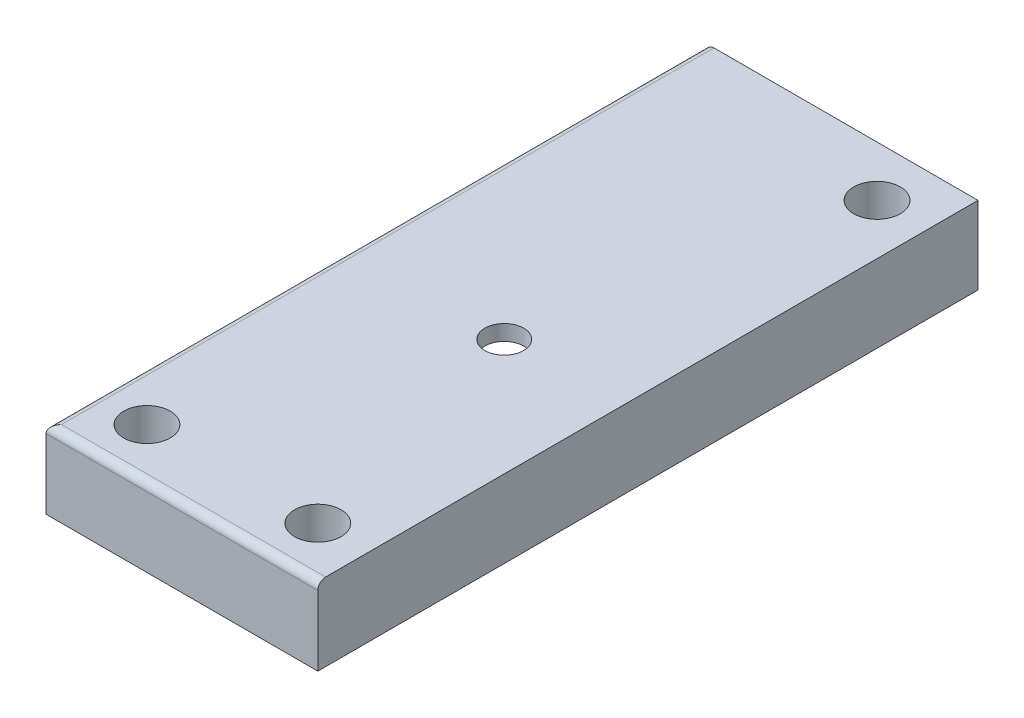
ISO-10303-21;
HEADER;
FILE_DESCRIPTION(('STEP AP214'),'2;1');
FILE_NAME('part.step','',(''),(''),'','','');
FILE_SCHEMA(('AUTOMOTIVE_DESIGN { 1 0 10303 214 1 1 1 1 }'));
ENDSEC;
DATA;
#1=APPLICATION_CONTEXT('core data for automotive mechanical design processes');
#2=APPLICATION_PROTOCOL_DEFINITION('international standard','automotive_design',2000,#1);
#3=PRODUCT_CONTEXT('',#1,'mechanical');
#4=PRODUCT('Part','Part','',(#3));
#5=PRODUCT_RELATED_PRODUCT_CATEGORY('part','',(#4));
#6=PRODUCT_DEFINITION_FORMATION('','',#4);
#7=PRODUCT_DEFINITION_CONTEXT('part definition',#1,'design');
#8=PRODUCT_DEFINITION('design','',#6,#7);
#9=PRODUCT_DEFINITION_SHAPE('','',#8);
#10=(LENGTH_UNIT() NAMED_UNIT(*) SI_UNIT(.MILLI.,.METRE.));
#11=(NAMED_UNIT(*) PLANE_ANGLE_UNIT() SI_UNIT($,.RADIAN.));
#12=(NAMED_UNIT(*) SI_UNIT($,.STERADIAN.) SOLID_ANGLE_UNIT());
#13=UNCERTAINTY_MEASURE_WITH_UNIT(LENGTH_MEASURE(1.E-05),#10,'distance_accuracy_value','');
#14=(GEOMETRIC_REPRESENTATION_CONTEXT(3) GLOBAL_UNCERTAINTY_ASSIGNED_CONTEXT((#13)) GLOBAL_UNIT_ASSIGNED_CONTEXT((#10,
#11,#12)) REPRESENTATION_CONTEXT('',''));
#15=CARTESIAN_POINT('',(0.,0.,0.));
#16=DIRECTION('',(0.,0.,1.));
#17=DIRECTION('',(1.,0.,0.));
#18=AXIS2_PLACEMENT_3D('',#15,#16,#17);
#19=CARTESIAN_POINT('',(11.,0.,-36.));
#20=DIRECTION('',(0.,1.,0.));
#21=DIRECTION('',(0.,0.,1.));
#22=AXIS2_PLACEMENT_3D('',#19,#20,#21);
#23=CYLINDRICAL_SURFACE('',#22,1.25);
#24=CARTESIAN_POINT('',(11.,0.,-36.));
#25=DIRECTION('',(0.,-1.,0.));
#26=DIRECTION('',(0.,0.,-1.));
#27=AXIS2_PLACEMENT_3D('',#24,#25,#26);
#28=CIRCLE('',#27,1.25);
#29=CARTESIAN_POINT('',(11.,0.,-37.25));
#30=VERTEX_POINT('',#29);
#31=EDGE_CURVE('E219',#30,#30,#28,.T.);
#32=ORIENTED_EDGE('',*,*,#31,.T.);
#33=EDGE_LOOP('',(#32));
#34=FACE_BOUND('',#33,.T.);
#35=CARTESIAN_POINT('',(11.,5.,-36.));
#36=DIRECTION('',(0.,1.,0.));
#37=DIRECTION('',(0.,0.,1.));
#38=AXIS2_PLACEMENT_3D('',#35,#36,#37);
#39=CIRCLE('',#38,1.25);
#40=CARTESIAN_POINT('',(11.,5.,-34.75));
#41=VERTEX_POINT('',#40);
#42=EDGE_CURVE('E226',#41,#41,#39,.T.);
#43=ORIENTED_EDGE('',*,*,#42,.T.);
#44=EDGE_LOOP('',(#43));
#45=FACE_BOUND('',#44,.T.);
#46=ADVANCED_FACE('F33',(#34,#45),#23,.F.);
#47=CARTESIAN_POINT('',(-11.,0.,36.));
#48=DIRECTION('',(0.,1.,0.));
#49=DIRECTION('',(0.,0.,1.));
#50=AXIS2_PLACEMENT_3D('',#47,#48,#49);
#51=CYLINDRICAL_SURFACE('',#50,1.25);
#52=CARTESIAN_POINT('',(-11.,0.,36.));
#53=DIRECTION('',(0.,-1.,0.));
#54=DIRECTION('',(0.,0.,-1.));
#55=AXIS2_PLACEMENT_3D('',#52,#53,#54);
#56=CIRCLE('',#55,1.25);
#57=CARTESIAN_POINT('',(-11.,0.,34.75));
#58=VERTEX_POINT('',#57);
#59=EDGE_CURVE('E292',#58,#58,#56,.T.);
#60=ORIENTED_EDGE('',*,*,#59,.T.);
#61=EDGE_LOOP('',(#60));
#62=FACE_BOUND('',#61,.T.);
#63=CARTESIAN_POINT('',(-11.,5.,36.));
#64=DIRECTION('',(0.,1.,0.));
#65=DIRECTION('',(0.,0.,1.));
#66=AXIS2_PLACEMENT_3D('',#63,#64,#65);
#67=CIRCLE('',#66,1.25);
#68=CARTESIAN_POINT('',(-11.,5.,37.25));
#69=VERTEX_POINT('',#68);
#70=EDGE_CURVE('E221',#69,#69,#67,.T.);
#71=ORIENTED_EDGE('',*,*,#70,.T.);
#72=EDGE_LOOP('',(#71));
#73=FACE_BOUND('',#72,.T.);
#74=ADVANCED_FACE('F362',(#62,#73),#51,.F.);
#75=CARTESIAN_POINT('',(11.,0.,36.));
#76=DIRECTION('',(0.,1.,0.));
#77=DIRECTION('',(0.,0.,1.));
#78=AXIS2_PLACEMENT_3D('',#75,#76,#77);
#79=CYLINDRICAL_SURFACE('',#78,1.25);
#80=CARTESIAN_POINT('',(11.,0.,36.));
#81=DIRECTION('',(0.,-1.,0.));
#82=DIRECTION('',(0.,0.,-1.));
#83=AXIS2_PLACEMENT_3D('',#80,#81,#82);
#84=CIRCLE('',#83,1.25);
#85=CARTESIAN_POINT('',(11.,0.,34.75));
#86=VERTEX_POINT('',#85);
#87=EDGE_CURVE('E164',#86,#86,#84,.T.);
#88=ORIENTED_EDGE('',*,*,#87,.T.);
#89=EDGE_LOOP('',(#88));
#90=FACE_BOUND('',#89,.T.);
#91=CARTESIAN_POINT('',(11.,5.,36.));
#92=DIRECTION('',(0.,1.,0.));
#93=DIRECTION('',(0.,0.,1.));
#94=AXIS2_PLACEMENT_3D('',#91,#92,#93);
#95=CIRCLE('',#94,1.25);
#96=CARTESIAN_POINT('',(11.,5.,37.25));
#97=VERTEX_POINT('',#96);
#98=EDGE_CURVE('E216',#97,#97,#95,.T.);
#99=ORIENTED_EDGE('',*,*,#98,.T.);
#100=EDGE_LOOP('',(#99));
#101=FACE_BOUND('',#100,.T.);
#102=ADVANCED_FACE('F368',(#90,#101),#79,.F.);
#103=CARTESIAN_POINT('',(15.5,8.,40.5));
#104=DIRECTION('',(1.,0.,0.));
#105=DIRECTION('',(0.,0.,-1.));
#106=AXIS2_PLACEMENT_3D('',#103,#104,#105);
#107=PLANE('',#106);
#108=DIRECTION('',(0.,1.,0.));
#109=VECTOR('',#108,1.);
#110=CARTESIAN_POINT('',(15.5,0.,-31.5));
#111=LINE('',#110,#109);
#112=CARTESIAN_POINT('',(15.5,0.,-31.5));
#113=VERTEX_POINT('',#112);
#114=CARTESIAN_POINT('',(15.5,8.,-31.5));
#115=VERTEX_POINT('',#114);
#116=EDGE_CURVE('E148',#113,#115,#111,.T.);
#117=ORIENTED_EDGE('',*,*,#116,.F.);
#118=DIRECTION('',(0.,0.,1.));
#119=VECTOR('',#118,1.);
#120=CARTESIAN_POINT('',(15.5,0.,40.5));
#121=LINE('',#120,#119);
#122=CARTESIAN_POINT('',(15.5,0.,31.5));
#123=VERTEX_POINT('',#122);
#124=EDGE_CURVE('E161',#113,#123,#121,.T.);
#125=ORIENTED_EDGE('',*,*,#124,.T.);
#126=DIRECTION('',(0.,1.,0.));
#127=VECTOR('',#126,1.);
#128=CARTESIAN_POINT('',(15.5,0.,31.5));
#129=LINE('',#128,#127);
#130=CARTESIAN_POINT('',(15.5,8.,31.5));
#131=VERTEX_POINT('',#130);
#132=EDGE_CURVE('E282',#123,#131,#129,.T.);
#133=ORIENTED_EDGE('',*,*,#132,.T.);
#134=DIRECTION('',(0.,0.,1.));
#135=VECTOR('',#134,1.);
#136=CARTESIAN_POINT('',(15.5,8.,40.5));
#137=LINE('',#136,#135);
#138=EDGE_CURVE('E163',#115,#131,#137,.T.);
#139=ORIENTED_EDGE('',*,*,#138,.F.);
#140=EDGE_LOOP('',(#117,#125,#133,#139));
#141=FACE_BOUND('',#140,.T.);
#142=ADVANCED_FACE('F159',(#141),#107,.F.);
#143=CARTESIAN_POINT('',(-15.5,8.,-40.5));
#144=DIRECTION('',(0.,0.,-1.));
#145=DIRECTION('',(-1.,0.,0.));
#146=AXIS2_PLACEMENT_3D('',#143,#144,#145);
#147=PLANE('',#146);
#148=DIRECTION('',(0.,1.,0.));
#149=VECTOR('',#148,1.);
#150=CARTESIAN_POINT('',(6.50000000000001,0.,-40.5));
#151=LINE('',#150,#149);
#152=CARTESIAN_POINT('',(6.50000000000001,0.,-40.5));
#153=VERTEX_POINT('',#152);
#154=CARTESIAN_POINT('',(6.50000000000001,8.,-40.5));
#155=VERTEX_POINT('',#154);
#156=EDGE_CURVE('E269',#153,#155,#151,.T.);
#157=ORIENTED_EDGE('',*,*,#156,.T.);
#158=DIRECTION('',(1.,0.,0.));
#159=VECTOR('',#158,1.);
#160=CARTESIAN_POINT('',(-15.5,8.,-40.5));
#161=LINE('',#160,#159);
#162=CARTESIAN_POINT('',(-15.5,8.,-40.5));
#163=VERTEX_POINT('',#162);
#164=EDGE_CURVE('E179',#163,#155,#161,.T.);
#165=ORIENTED_EDGE('',*,*,#164,.F.);
#166=DIRECTION('',(0.,-1.,0.));
#167=VECTOR('',#166,1.);
#168=CARTESIAN_POINT('',(-15.5,8.,-40.5));
#169=LINE('',#168,#167);
#170=CARTESIAN_POINT('',(-15.5,0.,-40.5));
#171=VERTEX_POINT('',#170);
#172=EDGE_CURVE('E186',#163,#171,#169,.T.);
#173=ORIENTED_EDGE('',*,*,#172,.T.);
#174=DIRECTION('',(1.,0.,0.));
#175=VECTOR('',#174,1.);
#176=CARTESIAN_POINT('',(-15.5,0.,-40.5));
#177=LINE('',#176,#175);
#178=EDGE_CURVE('E183',#171,#153,#177,.T.);
#179=ORIENTED_EDGE('',*,*,#178,.T.);
#180=EDGE_LOOP('',(#157,#165,#173,#179));
#181=FACE_BOUND('',#180,.T.);
#182=ADVANCED_FACE('F322',(#181),#147,.F.);
#183=CARTESIAN_POINT('',(-15.5,8.,40.5));
#184=DIRECTION('',(0.,0.,1.));
#185=DIRECTION('',(1.,0.,0.));
#186=AXIS2_PLACEMENT_3D('',#183,#184,#185);
#187=PLANE('',#186);
#188=DIRECTION('',(0.,1.,0.));
#189=VECTOR('',#188,1.);
#190=CARTESIAN_POINT('',(6.5,0.,40.5));
#191=LINE('',#190,#189);
#192=CARTESIAN_POINT('',(6.5,0.,40.5));
#193=VERTEX_POINT('',#192);
#194=CARTESIAN_POINT('',(6.5,8.,40.5));
#195=VERTEX_POINT('',#194);
#196=EDGE_CURVE('E290',#193,#195,#191,.T.);
#197=ORIENTED_EDGE('',*,*,#196,.F.);
#198=DIRECTION('',(-1.,0.,0.));
#199=VECTOR('',#198,1.);
#200=CARTESIAN_POINT('',(-15.5,0.,40.5));
#201=LINE('',#200,#199);
#202=CARTESIAN_POINT('',(-6.5,0.,40.5));
#203=VERTEX_POINT('',#202);
#204=EDGE_CURVE('E171',#193,#203,#201,.T.);
#205=ORIENTED_EDGE('',*,*,#204,.T.);
#206=DIRECTION('',(0.,1.,0.));
#207=VECTOR('',#206,1.);
#208=CARTESIAN_POINT('',(-6.5,0.,40.5));
#209=LINE('',#208,#207);
#210=CARTESIAN_POINT('',(-6.5,8.,40.5));
#211=VERTEX_POINT('',#210);
#212=EDGE_CURVE('E302',#203,#211,#209,.T.);
#213=ORIENTED_EDGE('',*,*,#212,.T.);
#214=DIRECTION('',(-1.,0.,0.));
#215=VECTOR('',#214,1.);
#216=CARTESIAN_POINT('',(-15.5,8.,40.5));
#217=LINE('',#216,#215);
#218=EDGE_CURVE('E311',#195,#211,#217,.T.);
#219=ORIENTED_EDGE('',*,*,#218,.F.);
#220=EDGE_LOOP('',(#197,#205,#213,#219));
#221=FACE_BOUND('',#220,.T.);
#222=ADVANCED_FACE('F338',(#221),#187,.F.);
#223=CARTESIAN_POINT('',(-15.5,8.,40.5));
#224=DIRECTION('',(-1.,0.,0.));
#225=DIRECTION('',(0.,0.,1.));
#226=AXIS2_PLACEMENT_3D('',#223,#224,#225);
#227=PLANE('',#226);
#228=DIRECTION('',(0.,1.,0.));
#229=VECTOR('',#228,1.);
#230=CARTESIAN_POINT('',(-15.5,0.,31.5));
#231=LINE('',#230,#229);
#232=CARTESIAN_POINT('',(-15.5,0.,31.5));
#233=VERTEX_POINT('',#232);
#234=CARTESIAN_POINT('',(-15.5,8.,31.5));
#235=VERTEX_POINT('',#234);
#236=EDGE_CURVE('E172',#233,#235,#231,.T.);
#237=ORIENTED_EDGE('',*,*,#236,.F.);
#238=DIRECTION('',(0.,0.,-1.));
#239=VECTOR('',#238,1.);
#240=CARTESIAN_POINT('',(-15.5,0.,40.5));
#241=LINE('',#240,#239);
#242=EDGE_CURVE('E174',#233,#171,#241,.T.);
#243=ORIENTED_EDGE('',*,*,#242,.T.);
#244=ORIENTED_EDGE('',*,*,#172,.F.);
#245=DIRECTION('',(0.,0.,-1.));
#246=VECTOR('',#245,1.);
#247=CARTESIAN_POINT('',(-15.5,8.,40.5));
#248=LINE('',#247,#246);
#249=EDGE_CURVE('E312',#235,#163,#248,.T.);
#250=ORIENTED_EDGE('',*,*,#249,.F.);
#251=EDGE_LOOP('',(#237,#243,#244,#250));
#252=FACE_BOUND('',#251,.T.);
#253=ADVANCED_FACE('F348',(#252),#227,.F.);
#254=CARTESIAN_POINT('',(17.5,10.,-42.5));
#255=DIRECTION('',(-1.,0.,0.));
#256=DIRECTION('',(0.,0.,1.));
#257=AXIS2_PLACEMENT_3D('',#254,#255,#256);
#258=PLANE('',#257);
#259=DIRECTION('',(0.,0.,-1.));
#260=VECTOR('',#259,1.);
#261=CARTESIAN_POINT('',(17.5,10.,-42.5));
#262=LINE('',#261,#260);
#263=CARTESIAN_POINT('',(17.5,10.,41.5));
#264=VERTEX_POINT('',#263);
#265=CARTESIAN_POINT('',(17.5,10.,-42.5));
#266=VERTEX_POINT('',#265);
#267=EDGE_CURVE('E190',#264,#266,#262,.T.);
#268=ORIENTED_EDGE('',*,*,#267,.F.);
#269=CARTESIAN_POINT('',(17.5,9.,41.5));
#270=DIRECTION('',(-1.,0.,0.));
#271=DIRECTION('',(0.,0.,1.));
#272=AXIS2_PLACEMENT_3D('',#269,#270,#271);
#273=CIRCLE('',#272,1.);
#274=CARTESIAN_POINT('',(17.5,9.,42.5));
#275=VERTEX_POINT('',#274);
#276=EDGE_CURVE('E42',#264,#275,#273,.F.);
#277=ORIENTED_EDGE('',*,*,#276,.T.);
#278=DIRECTION('',(0.,-1.,0.));
#279=VECTOR('',#278,1.);
#280=CARTESIAN_POINT('',(17.5,10.,42.5));
#281=LINE('',#280,#279);
#282=CARTESIAN_POINT('',(17.5,0.,42.5));
#283=VERTEX_POINT('',#282);
#284=EDGE_CURVE('E196',#275,#283,#281,.T.);
#285=ORIENTED_EDGE('',*,*,#284,.T.);
#286=DIRECTION('',(0.,0.,-1.));
#287=VECTOR('',#286,1.);
#288=CARTESIAN_POINT('',(17.5,0.,-42.5));
#289=LINE('',#288,#287);
#290=CARTESIAN_POINT('',(17.5,0.,-42.5));
#291=VERTEX_POINT('',#290);
#292=EDGE_CURVE('E189',#283,#291,#289,.T.);
#293=ORIENTED_EDGE('',*,*,#292,.T.);
#294=DIRECTION('',(0.,-1.,0.));
#295=VECTOR('',#294,1.);
#296=CARTESIAN_POINT('',(17.5,10.,-42.5));
#297=LINE('',#296,#295);
#298=EDGE_CURVE('E212',#266,#291,#297,.T.);
#299=ORIENTED_EDGE('',*,*,#298,.F.);
#300=EDGE_LOOP('',(#268,#277,#285,#293,#299));
#301=FACE_BOUND('',#300,.T.);
#302=ADVANCED_FACE('F581',(#301),#258,.F.);
#303=CARTESIAN_POINT('',(-17.5,10.,-42.5));
#304=DIRECTION('',(0.,0.,1.));
#305=DIRECTION('',(1.,0.,0.));
#306=AXIS2_PLACEMENT_3D('',#303,#304,#305);
#307=PLANE('',#306);
#308=DIRECTION('',(0.,-1.,0.));
#309=VECTOR('',#308,1.);
#310=CARTESIAN_POINT('',(-17.5,10.,-42.5));
#311=LINE('',#310,#309);
#312=CARTESIAN_POINT('',(-17.5,9.,-42.5));
#313=VERTEX_POINT('',#312);
#314=CARTESIAN_POINT('',(-17.5,0.,-42.5));
#315=VERTEX_POINT('',#314);
#316=EDGE_CURVE('E210',#313,#315,#311,.T.);
#317=ORIENTED_EDGE('',*,*,#316,.F.);
#318=CARTESIAN_POINT('',(-16.5,9.,-42.5));
#319=DIRECTION('',(0.,0.,1.));
#320=DIRECTION('',(1.,0.,0.));
#321=AXIS2_PLACEMENT_3D('',#318,#319,#320);
#322=CIRCLE('',#321,1.);
#323=CARTESIAN_POINT('',(-16.5,10.,-42.5));
#324=VERTEX_POINT('',#323);
#325=EDGE_CURVE('E236',#313,#324,#322,.F.);
#326=ORIENTED_EDGE('',*,*,#325,.T.);
#327=DIRECTION('',(-1.,0.,0.));
#328=VECTOR('',#327,1.);
#329=CARTESIAN_POINT('',(-17.5,10.,-42.5));
#330=LINE('',#329,#328);
#331=EDGE_CURVE('E192',#266,#324,#330,.T.);
#332=ORIENTED_EDGE('',*,*,#331,.F.);
#333=ORIENTED_EDGE('',*,*,#298,.T.);
#334=DIRECTION('',(-1.,0.,0.));
#335=VECTOR('',#334,1.);
#336=CARTESIAN_POINT('',(-17.5,0.,-42.5));
#337=LINE('',#336,#335);
#338=EDGE_CURVE('E199',#291,#315,#337,.T.);
#339=ORIENTED_EDGE('',*,*,#338,.T.);
#340=EDGE_LOOP('',(#317,#326,#332,#333,#339));
#341=FACE_BOUND('',#340,.T.);
#342=ADVANCED_FACE('F585',(#341),#307,.F.);
#343=CARTESIAN_POINT('',(-17.5,10.,-42.5));
#344=DIRECTION('',(1.,0.,0.));
#345=DIRECTION('',(0.,0.,-1.));
#346=AXIS2_PLACEMENT_3D('',#343,#344,#345);
#347=PLANE('',#346);
#348=DIRECTION('',(0.,-1.,0.));
#349=VECTOR('',#348,1.);
#350=CARTESIAN_POINT('',(-17.5,10.,42.5));
#351=LINE('',#350,#349);
#352=CARTESIAN_POINT('',(-17.5,9.,42.5));
#353=VERTEX_POINT('',#352);
#354=CARTESIAN_POINT('',(-17.5,0.,42.5));
#355=VERTEX_POINT('',#354);
#356=EDGE_CURVE('E208',#353,#355,#351,.T.);
#357=ORIENTED_EDGE('',*,*,#356,.F.);
#358=DIRECTION('',(0.,0.,1.));
#359=VECTOR('',#358,1.);
#360=CARTESIAN_POINT('',(-17.5,9.,-42.5));
#361=LINE('',#360,#359);
#362=EDGE_CURVE('E57',#353,#313,#361,.F.);
#363=ORIENTED_EDGE('',*,*,#362,.T.);
#364=ORIENTED_EDGE('',*,*,#316,.T.);
#365=DIRECTION('',(0.,0.,1.));
#366=VECTOR('',#365,1.);
#367=CARTESIAN_POINT('',(-17.5,0.,-42.5));
#368=LINE('',#367,#366);
#369=EDGE_CURVE('E202',#315,#355,#368,.T.);
#370=ORIENTED_EDGE('',*,*,#369,.T.);
#371=EDGE_LOOP('',(#357,#363,#364,#370));
#372=FACE_BOUND('',#371,.T.);
#373=ADVANCED_FACE('F591',(#372),#347,.F.);
#374=CARTESIAN_POINT('',(-17.5,10.,42.5));
#375=DIRECTION('',(0.,0.,-1.));
#376=DIRECTION('',(-1.,0.,0.));
#377=AXIS2_PLACEMENT_3D('',#374,#375,#376);
#378=PLANE('',#377);
#379=ORIENTED_EDGE('',*,*,#284,.F.);
#380=DIRECTION('',(1.,0.,0.));
#381=VECTOR('',#380,1.);
#382=CARTESIAN_POINT('',(-17.5,9.,42.5));
#383=LINE('',#382,#381);
#384=EDGE_CURVE('E11',#275,#353,#383,.F.);
#385=ORIENTED_EDGE('',*,*,#384,.T.);
#386=ORIENTED_EDGE('',*,*,#356,.T.);
#387=DIRECTION('',(1.,0.,0.));
#388=VECTOR('',#387,1.);
#389=CARTESIAN_POINT('',(-17.5,0.,42.5));
#390=LINE('',#389,#388);
#391=EDGE_CURVE('E193',#355,#283,#390,.T.);
#392=ORIENTED_EDGE('',*,*,#391,.T.);
#393=EDGE_LOOP('',(#379,#385,#386,#392));
#394=FACE_BOUND('',#393,.T.);
#395=ADVANCED_FACE('F481',(#394),#378,.F.);
#396=CARTESIAN_POINT('',(0.,10.,0.));
#397=DIRECTION('',(0.,1.,0.));
#398=DIRECTION('',(0.,0.,1.));
#399=AXIS2_PLACEMENT_3D('',#396,#397,#398);
#400=PLANE('',#399);
#401=CARTESIAN_POINT('',(2.5,10.,3.50000000000002));
#402=DIRECTION('',(0.,1.,0.));
#403=DIRECTION('',(0.,0.,1.));
#404=AXIS2_PLACEMENT_3D('',#401,#402,#403);
#405=CIRCLE('',#404,2.5);
#406=CARTESIAN_POINT('',(2.5,10.,6.00000000000002));
#407=VERTEX_POINT('',#406);
#408=EDGE_CURVE('E247',#407,#407,#405,.T.);
#409=ORIENTED_EDGE('',*,*,#408,.F.);
#410=EDGE_LOOP('',(#409));
#411=FACE_BOUND('',#410,.T.);
#412=CARTESIAN_POINT('',(11.,10.,-36.));
#413=DIRECTION('',(0.,1.,0.));
#414=DIRECTION('',(0.,0.,1.));
#415=AXIS2_PLACEMENT_3D('',#412,#413,#414);
#416=CIRCLE('',#415,3.);
#417=CARTESIAN_POINT('',(11.,10.,-33.));
#418=VERTEX_POINT('',#417);
#419=EDGE_CURVE('E239',#418,#418,#416,.T.);
#420=ORIENTED_EDGE('',*,*,#419,.F.);
#421=EDGE_LOOP('',(#420));
#422=FACE_BOUND('',#421,.T.);
#423=CARTESIAN_POINT('',(-11.,10.,36.));
#424=DIRECTION('',(0.,1.,0.));
#425=DIRECTION('',(0.,0.,1.));
#426=AXIS2_PLACEMENT_3D('',#423,#424,#425);
#427=CIRCLE('',#426,3.);
#428=CARTESIAN_POINT('',(-11.,10.,39.));
#429=VERTEX_POINT('',#428);
#430=EDGE_CURVE('E229',#429,#429,#427,.T.);
#431=ORIENTED_EDGE('',*,*,#430,.F.);
#432=EDGE_LOOP('',(#431));
#433=FACE_BOUND('',#432,.T.);
#434=CARTESIAN_POINT('',(11.,10.,36.));
#435=DIRECTION('',(0.,1.,0.));
#436=DIRECTION('',(0.,0.,1.));
#437=AXIS2_PLACEMENT_3D('',#434,#435,#436);
#438=CIRCLE('',#437,3.);
#439=CARTESIAN_POINT('',(11.,10.,39.));
#440=VERTEX_POINT('',#439);
#441=EDGE_CURVE('E224',#440,#440,#438,.T.);
#442=ORIENTED_EDGE('',*,*,#441,.F.);
#443=EDGE_LOOP('',(#442));
#444=FACE_BOUND('',#443,.T.);
#445=ORIENTED_EDGE('',*,*,#331,.T.);
#446=DIRECTION('',(0.,0.,1.));
#447=VECTOR('',#446,1.);
#448=CARTESIAN_POINT('',(-16.5,10.,42.5));
#449=LINE('',#448,#447);
#450=CARTESIAN_POINT('',(-16.5,10.,41.5));
#451=VERTEX_POINT('',#450);
#452=EDGE_CURVE('E232',#324,#451,#449,.T.);
#453=ORIENTED_EDGE('',*,*,#452,.T.);
#454=DIRECTION('',(1.,0.,0.));
#455=VECTOR('',#454,1.);
#456=CARTESIAN_POINT('',(17.5,10.,41.5));
#457=LINE('',#456,#455);
#458=EDGE_CURVE('E215',#451,#264,#457,.T.);
#459=ORIENTED_EDGE('',*,*,#458,.T.);
#460=ORIENTED_EDGE('',*,*,#267,.T.);
#461=EDGE_LOOP('',(#445,#453,#459,#460));
#462=FACE_BOUND('',#461,.T.);
#463=ADVANCED_FACE('F478',(#411,#422,#433,#444,#462),#400,.T.);
#464=CARTESIAN_POINT('',(0.,0.,0.));
#465=DIRECTION('',(0.,1.,0.));
#466=DIRECTION('',(0.,0.,1.));
#467=AXIS2_PLACEMENT_3D('',#464,#465,#466);
#468=PLANE('',#467);
#469=ORIENTED_EDGE('',*,*,#124,.F.);
#470=DIRECTION('',(-1.,0.,0.));
#471=VECTOR('',#470,1.);
#472=CARTESIAN_POINT('',(15.5,0.,-31.5));
#473=LINE('',#472,#471);
#474=CARTESIAN_POINT('',(6.50000000000001,0.,-31.5));
#475=VERTEX_POINT('',#474);
#476=EDGE_CURVE('E144',#113,#475,#473,.T.);
#477=ORIENTED_EDGE('',*,*,#476,.T.);
#478=DIRECTION('',(0.,0.,-1.));
#479=VECTOR('',#478,1.);
#480=CARTESIAN_POINT('',(6.50000000000001,0.,-40.5));
#481=LINE('',#480,#479);
#482=EDGE_CURVE('E154',#475,#153,#481,.T.);
#483=ORIENTED_EDGE('',*,*,#482,.T.);
#484=ORIENTED_EDGE('',*,*,#178,.F.);
#485=ORIENTED_EDGE('',*,*,#242,.F.);
#486=DIRECTION('',(1.,0.,0.));
#487=VECTOR('',#486,1.);
#488=CARTESIAN_POINT('',(-15.5,0.,31.5));
#489=LINE('',#488,#487);
#490=CARTESIAN_POINT('',(-6.5,0.,31.5));
#491=VERTEX_POINT('',#490);
#492=EDGE_CURVE('E296',#233,#491,#489,.T.);
#493=ORIENTED_EDGE('',*,*,#492,.T.);
#494=DIRECTION('',(0.,0.,1.));
#495=VECTOR('',#494,1.);
#496=CARTESIAN_POINT('',(-6.5,0.,40.5));
#497=LINE('',#496,#495);
#498=EDGE_CURVE('E298',#491,#203,#497,.T.);
#499=ORIENTED_EDGE('',*,*,#498,.T.);
#500=ORIENTED_EDGE('',*,*,#204,.F.);
#501=DIRECTION('',(0.,0.,-1.));
#502=VECTOR('',#501,1.);
#503=CARTESIAN_POINT('',(6.5,0.,40.5));
#504=LINE('',#503,#502);
#505=CARTESIAN_POINT('',(6.5,0.,31.5));
#506=VERTEX_POINT('',#505);
#507=EDGE_CURVE('E278',#193,#506,#504,.T.);
#508=ORIENTED_EDGE('',*,*,#507,.T.);
#509=DIRECTION('',(1.,0.,0.));
#510=VECTOR('',#509,1.);
#511=CARTESIAN_POINT('',(15.5,0.,31.5));
#512=LINE('',#511,#510);
#513=EDGE_CURVE('E169',#506,#123,#512,.T.);
#514=ORIENTED_EDGE('',*,*,#513,.T.);
#515=EDGE_LOOP('',(#469,#477,#483,#484,#485,#493,#499,#500,#508,#514));
#516=FACE_BOUND('',#515,.T.);
#517=ORIENTED_EDGE('',*,*,#292,.F.);
#518=ORIENTED_EDGE('',*,*,#391,.F.);
#519=ORIENTED_EDGE('',*,*,#369,.F.);
#520=ORIENTED_EDGE('',*,*,#338,.F.);
#521=EDGE_LOOP('',(#517,#518,#519,#520));
#522=FACE_BOUND('',#521,.T.);
#523=ORIENTED_EDGE('',*,*,#59,.F.);
#524=EDGE_LOOP('',(#523));
#525=FACE_BOUND('',#524,.T.);
#526=ORIENTED_EDGE('',*,*,#87,.F.);
#527=EDGE_LOOP('',(#526));
#528=FACE_BOUND('',#527,.T.);
#529=ORIENTED_EDGE('',*,*,#31,.F.);
#530=EDGE_LOOP('',(#529));
#531=FACE_BOUND('',#530,.T.);
#532=ADVANCED_FACE('F166',(#516,#522,#525,#528,#531),#468,.F.);
#533=CARTESIAN_POINT('',(0.,8.,0.));
#534=DIRECTION('',(0.,-1.,0.));
#535=DIRECTION('',(0.,0.,-1.));
#536=AXIS2_PLACEMENT_3D('',#533,#534,#535);
#537=PLANE('',#536);
#538=CARTESIAN_POINT('',(2.5,8.,3.50000000000002));
#539=DIRECTION('',(0.,-1.,0.));
#540=DIRECTION('',(0.,0.,-1.));
#541=AXIS2_PLACEMENT_3D('',#538,#539,#540);
#542=CIRCLE('',#541,2.5);
#543=CARTESIAN_POINT('',(2.5,8.,1.00000000000002));
#544=VERTEX_POINT('',#543);
#545=EDGE_CURVE('E37',#544,#544,#542,.T.);
#546=ORIENTED_EDGE('',*,*,#545,.F.);
#547=EDGE_LOOP('',(#546));
#548=FACE_BOUND('',#547,.T.);
#549=DIRECTION('',(0.,0.,-1.));
#550=VECTOR('',#549,1.);
#551=CARTESIAN_POINT('',(6.50000000000001,8.,-40.5));
#552=LINE('',#551,#550);
#553=CARTESIAN_POINT('',(6.50000000000001,8.,-31.5));
#554=VERTEX_POINT('',#553);
#555=EDGE_CURVE('E155',#554,#155,#552,.T.);
#556=ORIENTED_EDGE('',*,*,#555,.F.);
#557=DIRECTION('',(-1.,0.,0.));
#558=VECTOR('',#557,1.);
#559=CARTESIAN_POINT('',(15.5,8.,-31.5));
#560=LINE('',#559,#558);
#561=EDGE_CURVE('E266',#115,#554,#560,.T.);
#562=ORIENTED_EDGE('',*,*,#561,.F.);
#563=ORIENTED_EDGE('',*,*,#138,.T.);
#564=DIRECTION('',(1.,0.,0.));
#565=VECTOR('',#564,1.);
#566=CARTESIAN_POINT('',(15.5,8.,31.5));
#567=LINE('',#566,#565);
#568=CARTESIAN_POINT('',(6.5,8.,31.5));
#569=VERTEX_POINT('',#568);
#570=EDGE_CURVE('E280',#569,#131,#567,.T.);
#571=ORIENTED_EDGE('',*,*,#570,.F.);
#572=DIRECTION('',(0.,0.,-1.));
#573=VECTOR('',#572,1.);
#574=CARTESIAN_POINT('',(6.5,8.,40.5));
#575=LINE('',#574,#573);
#576=EDGE_CURVE('E277',#195,#569,#575,.T.);
#577=ORIENTED_EDGE('',*,*,#576,.F.);
#578=ORIENTED_EDGE('',*,*,#218,.T.);
#579=DIRECTION('',(0.,0.,1.));
#580=VECTOR('',#579,1.);
#581=CARTESIAN_POINT('',(-6.5,8.,40.5));
#582=LINE('',#581,#580);
#583=CARTESIAN_POINT('',(-6.5,8.,31.5));
#584=VERTEX_POINT('',#583);
#585=EDGE_CURVE('E299',#584,#211,#582,.T.);
#586=ORIENTED_EDGE('',*,*,#585,.F.);
#587=DIRECTION('',(1.,0.,0.));
#588=VECTOR('',#587,1.);
#589=CARTESIAN_POINT('',(-15.5,8.,31.5));
#590=LINE('',#589,#588);
#591=EDGE_CURVE('E295',#235,#584,#590,.T.);
#592=ORIENTED_EDGE('',*,*,#591,.F.);
#593=ORIENTED_EDGE('',*,*,#249,.T.);
#594=ORIENTED_EDGE('',*,*,#164,.T.);
#595=EDGE_LOOP('',(#556,#562,#563,#571,#577,#578,#586,#592,#593,#594));
#596=FACE_BOUND('',#595,.T.);
#597=ADVANCED_FACE('F320',(#548,#596),#537,.T.);
#598=CARTESIAN_POINT('',(-15.5,0.,31.5));
#599=DIRECTION('',(0.,0.,1.));
#600=DIRECTION('',(1.,0.,0.));
#601=AXIS2_PLACEMENT_3D('',#598,#599,#600);
#602=PLANE('',#601);
#603=ORIENTED_EDGE('',*,*,#591,.T.);
#604=DIRECTION('',(0.,1.,0.));
#605=VECTOR('',#604,1.);
#606=CARTESIAN_POINT('',(-6.5,0.,31.5));
#607=LINE('',#606,#605);
#608=EDGE_CURVE('E176',#491,#584,#607,.T.);
#609=ORIENTED_EDGE('',*,*,#608,.F.);
#610=ORIENTED_EDGE('',*,*,#492,.F.);
#611=ORIENTED_EDGE('',*,*,#236,.T.);
#612=EDGE_LOOP('',(#603,#609,#610,#611));
#613=FACE_BOUND('',#612,.T.);
#614=ADVANCED_FACE('F350',(#613),#602,.F.);
#615=CARTESIAN_POINT('',(-6.5,0.,40.5));
#616=DIRECTION('',(-1.,0.,0.));
#617=DIRECTION('',(0.,0.,1.));
#618=AXIS2_PLACEMENT_3D('',#615,#616,#617);
#619=PLANE('',#618);
#620=ORIENTED_EDGE('',*,*,#585,.T.);
#621=ORIENTED_EDGE('',*,*,#212,.F.);
#622=ORIENTED_EDGE('',*,*,#498,.F.);
#623=ORIENTED_EDGE('',*,*,#608,.T.);
#624=EDGE_LOOP('',(#620,#621,#622,#623));
#625=FACE_BOUND('',#624,.T.);
#626=ADVANCED_FACE('F343',(#625),#619,.F.);
#627=CARTESIAN_POINT('',(6.5,0.,40.5));
#628=DIRECTION('',(1.,0.,0.));
#629=DIRECTION('',(0.,0.,-1.));
#630=AXIS2_PLACEMENT_3D('',#627,#628,#629);
#631=PLANE('',#630);
#632=ORIENTED_EDGE('',*,*,#576,.T.);
#633=DIRECTION('',(0.,1.,0.));
#634=VECTOR('',#633,1.);
#635=CARTESIAN_POINT('',(6.5,0.,31.5));
#636=LINE('',#635,#634);
#637=EDGE_CURVE('E288',#506,#569,#636,.T.);
#638=ORIENTED_EDGE('',*,*,#637,.F.);
#639=ORIENTED_EDGE('',*,*,#507,.F.);
#640=ORIENTED_EDGE('',*,*,#196,.T.);
#641=EDGE_LOOP('',(#632,#638,#639,#640));
#642=FACE_BOUND('',#641,.T.);
#643=ADVANCED_FACE('F333',(#642),#631,.F.);
#644=CARTESIAN_POINT('',(15.5,0.,31.5));
#645=DIRECTION('',(0.,0.,1.));
#646=DIRECTION('',(1.,0.,0.));
#647=AXIS2_PLACEMENT_3D('',#644,#645,#646);
#648=PLANE('',#647);
#649=ORIENTED_EDGE('',*,*,#570,.T.);
#650=ORIENTED_EDGE('',*,*,#132,.F.);
#651=ORIENTED_EDGE('',*,*,#513,.F.);
#652=ORIENTED_EDGE('',*,*,#637,.T.);
#653=EDGE_LOOP('',(#649,#650,#651,#652));
#654=FACE_BOUND('',#653,.T.);
#655=ADVANCED_FACE('F330',(#654),#648,.F.);
#656=CARTESIAN_POINT('',(15.5,0.,-31.5));
#657=DIRECTION('',(0.,0.,-1.));
#658=DIRECTION('',(-1.,0.,0.));
#659=AXIS2_PLACEMENT_3D('',#656,#657,#658);
#660=PLANE('',#659);
#661=ORIENTED_EDGE('',*,*,#561,.T.);
#662=DIRECTION('',(0.,1.,0.));
#663=VECTOR('',#662,1.);
#664=CARTESIAN_POINT('',(6.50000000000001,0.,-31.5));
#665=LINE('',#664,#663);
#666=EDGE_CURVE('E150',#475,#554,#665,.T.);
#667=ORIENTED_EDGE('',*,*,#666,.F.);
#668=ORIENTED_EDGE('',*,*,#476,.F.);
#669=ORIENTED_EDGE('',*,*,#116,.T.);
#670=EDGE_LOOP('',(#661,#667,#668,#669));
#671=FACE_BOUND('',#670,.T.);
#672=ADVANCED_FACE('F147',(#671),#660,.F.);
#673=CARTESIAN_POINT('',(6.50000000000001,0.,-40.5));
#674=DIRECTION('',(1.,0.,0.));
#675=DIRECTION('',(0.,0.,-1.));
#676=AXIS2_PLACEMENT_3D('',#673,#674,#675);
#677=PLANE('',#676);
#678=ORIENTED_EDGE('',*,*,#555,.T.);
#679=ORIENTED_EDGE('',*,*,#156,.F.);
#680=ORIENTED_EDGE('',*,*,#482,.F.);
#681=ORIENTED_EDGE('',*,*,#666,.T.);
#682=EDGE_LOOP('',(#678,#679,#680,#681));
#683=FACE_BOUND('',#682,.T.);
#684=ADVANCED_FACE('F326',(#683),#677,.F.);
#685=CARTESIAN_POINT('',(11.,5.,36.));
#686=DIRECTION('',(0.,1.,0.));
#687=DIRECTION('',(0.,0.,1.));
#688=AXIS2_PLACEMENT_3D('',#685,#686,#687);
#689=CYLINDRICAL_SURFACE('',#688,3.);
#690=CARTESIAN_POINT('',(11.,5.,36.));
#691=DIRECTION('',(0.,1.,0.));
#692=DIRECTION('',(0.,0.,1.));
#693=AXIS2_PLACEMENT_3D('',#690,#691,#692);
#694=CIRCLE('',#693,3.);
#695=CARTESIAN_POINT('',(11.,5.,39.));
#696=VERTEX_POINT('',#695);
#697=EDGE_CURVE('E220',#696,#696,#694,.T.);
#698=ORIENTED_EDGE('',*,*,#697,.F.);
#699=EDGE_LOOP('',(#698));
#700=FACE_BOUND('',#699,.T.);
#701=ORIENTED_EDGE('',*,*,#441,.T.);
#702=EDGE_LOOP('',(#701));
#703=FACE_BOUND('',#702,.T.);
#704=ADVANCED_FACE('F374',(#700,#703),#689,.F.);
#705=CARTESIAN_POINT('',(11.,5.,36.));
#706=DIRECTION('',(0.,1.,0.));
#707=DIRECTION('',(0.,0.,1.));
#708=AXIS2_PLACEMENT_3D('',#705,#706,#707);
#709=PLANE('',#708);
#710=ORIENTED_EDGE('',*,*,#98,.F.);
#711=EDGE_LOOP('',(#710));
#712=FACE_BOUND('',#711,.T.);
#713=ORIENTED_EDGE('',*,*,#697,.T.);
#714=EDGE_LOOP('',(#713));
#715=FACE_BOUND('',#714,.T.);
#716=ADVANCED_FACE('F408',(#712,#715),#709,.T.);
#717=CARTESIAN_POINT('',(-11.,5.,36.));
#718=DIRECTION('',(0.,1.,0.));
#719=DIRECTION('',(0.,0.,1.));
#720=AXIS2_PLACEMENT_3D('',#717,#718,#719);
#721=CYLINDRICAL_SURFACE('',#720,3.);
#722=CARTESIAN_POINT('',(-11.,5.,36.));
#723=DIRECTION('',(0.,1.,0.));
#724=DIRECTION('',(0.,0.,1.));
#725=AXIS2_PLACEMENT_3D('',#722,#723,#724);
#726=CIRCLE('',#725,3.);
#727=CARTESIAN_POINT('',(-11.,5.,39.));
#728=VERTEX_POINT('',#727);
#729=EDGE_CURVE('E225',#728,#728,#726,.T.);
#730=ORIENTED_EDGE('',*,*,#729,.F.);
#731=EDGE_LOOP('',(#730));
#732=FACE_BOUND('',#731,.T.);
#733=ORIENTED_EDGE('',*,*,#430,.T.);
#734=EDGE_LOOP('',(#733));
#735=FACE_BOUND('',#734,.T.);
#736=ADVANCED_FACE('F416',(#732,#735),#721,.F.);
#737=CARTESIAN_POINT('',(-11.,5.,36.));
#738=DIRECTION('',(0.,1.,0.));
#739=DIRECTION('',(0.,0.,1.));
#740=AXIS2_PLACEMENT_3D('',#737,#738,#739);
#741=PLANE('',#740);
#742=ORIENTED_EDGE('',*,*,#70,.F.);
#743=EDGE_LOOP('',(#742));
#744=FACE_BOUND('',#743,.T.);
#745=ORIENTED_EDGE('',*,*,#729,.T.);
#746=EDGE_LOOP('',(#745));
#747=FACE_BOUND('',#746,.T.);
#748=ADVANCED_FACE('F423',(#744,#747),#741,.T.);
#749=CARTESIAN_POINT('',(11.,5.,-36.));
#750=DIRECTION('',(0.,1.,0.));
#751=DIRECTION('',(0.,0.,1.));
#752=AXIS2_PLACEMENT_3D('',#749,#750,#751);
#753=CYLINDRICAL_SURFACE('',#752,3.);
#754=CARTESIAN_POINT('',(11.,5.,-36.));
#755=DIRECTION('',(0.,1.,0.));
#756=DIRECTION('',(0.,0.,1.));
#757=AXIS2_PLACEMENT_3D('',#754,#755,#756);
#758=CIRCLE('',#757,3.);
#759=CARTESIAN_POINT('',(11.,5.,-33.));
#760=VERTEX_POINT('',#759);
#761=EDGE_CURVE('E230',#760,#760,#758,.T.);
#762=ORIENTED_EDGE('',*,*,#761,.F.);
#763=EDGE_LOOP('',(#762));
#764=FACE_BOUND('',#763,.T.);
#765=ORIENTED_EDGE('',*,*,#419,.T.);
#766=EDGE_LOOP('',(#765));
#767=FACE_BOUND('',#766,.T.);
#768=ADVANCED_FACE('F431',(#764,#767),#753,.F.);
#769=CARTESIAN_POINT('',(11.,5.,-36.));
#770=DIRECTION('',(0.,1.,0.));
#771=DIRECTION('',(0.,0.,1.));
#772=AXIS2_PLACEMENT_3D('',#769,#770,#771);
#773=PLANE('',#772);
#774=ORIENTED_EDGE('',*,*,#42,.F.);
#775=EDGE_LOOP('',(#774));
#776=FACE_BOUND('',#775,.T.);
#777=ORIENTED_EDGE('',*,*,#761,.T.);
#778=EDGE_LOOP('',(#777));
#779=FACE_BOUND('',#778,.T.);
#780=ADVANCED_FACE('F439',(#776,#779),#773,.T.);
#781=CARTESIAN_POINT('',(0.,9.,41.5));
#782=DIRECTION('',(-1.,0.,0.));
#783=DIRECTION('',(0.,0.,1.));
#784=AXIS2_PLACEMENT_3D('',#781,#782,#783);
#785=CYLINDRICAL_SURFACE('',#784,1.);
#786=ORIENTED_EDGE('',*,*,#276,.F.);
#787=ORIENTED_EDGE('',*,*,#458,.F.);
#788=CARTESIAN_POINT('',(-16.5,9.,41.5));
#789=DIRECTION('',(-0.707106781186547,0.,-0.707106781186547));
#790=DIRECTION('',(-0.707106781186547,0.,0.707106781186548));
#791=AXIS2_PLACEMENT_3D('',#788,#789,#790);
#792=ELLIPSE('',#791,1.41421356237309,1.);
#793=EDGE_CURVE('E238',#353,#451,#792,.T.);
#794=ORIENTED_EDGE('',*,*,#793,.F.);
#795=ORIENTED_EDGE('',*,*,#384,.F.);
#796=EDGE_LOOP('',(#786,#787,#794,#795));
#797=FACE_BOUND('',#796,.T.);
#798=ADVANCED_FACE('F35',(#797),#785,.T.);
#799=CARTESIAN_POINT('',(-16.5,9.,0.));
#800=DIRECTION('',(0.,0.,-1.));
#801=DIRECTION('',(-1.,0.,0.));
#802=AXIS2_PLACEMENT_3D('',#799,#800,#801);
#803=CYLINDRICAL_SURFACE('',#802,1.);
#804=ORIENTED_EDGE('',*,*,#325,.F.);
#805=ORIENTED_EDGE('',*,*,#362,.F.);
#806=ORIENTED_EDGE('',*,*,#793,.T.);
#807=ORIENTED_EDGE('',*,*,#452,.F.);
#808=EDGE_LOOP('',(#804,#805,#806,#807));
#809=FACE_BOUND('',#808,.T.);
#810=ADVANCED_FACE('F455',(#809),#803,.T.);
#811=CARTESIAN_POINT('',(2.5,5.,3.50000000000002));
#812=DIRECTION('',(0.,1.,0.));
#813=DIRECTION('',(0.,0.,1.));
#814=AXIS2_PLACEMENT_3D('',#811,#812,#813);
#815=CYLINDRICAL_SURFACE('',#814,2.5);
#816=ORIENTED_EDGE('',*,*,#545,.T.);
#817=EDGE_LOOP('',(#816));
#818=FACE_BOUND('',#817,.T.);
#819=ORIENTED_EDGE('',*,*,#408,.T.);
#820=EDGE_LOOP('',(#819));
#821=FACE_BOUND('',#820,.T.);
#822=ADVANCED_FACE('F463',(#818,#821),#815,.F.);
#823=CLOSED_SHELL('',(#46,#74,#102,#142,#182,#222,#253,#302,#342,#373,#395,#463,#532,#597,#614,
#626,#643,#655,#672,#684,#704,#716,#736,#748,#768,#780,#798,#810,#822));
#824=MANIFOLD_SOLID_BREP('B2',#823);
#825=ADVANCED_BREP_SHAPE_REPRESENTATION('',(#18,#824),#14);
#826=SHAPE_DEFINITION_REPRESENTATION(#9,#825);
ENDSEC;
END-ISO-10303-21;
